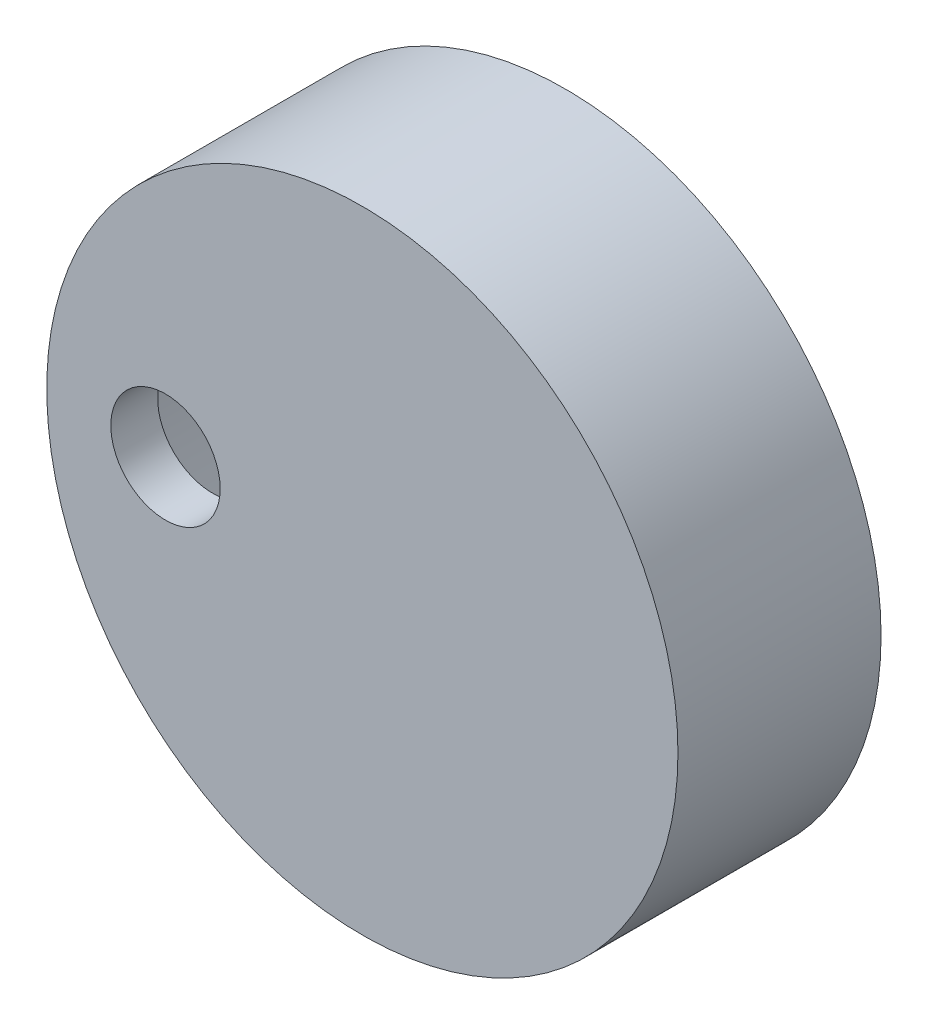
ISO-10303-21;
HEADER;
FILE_DESCRIPTION(('STEP AP214'),'2;1');
FILE_NAME('part.step','',(''),(''),'','','');
FILE_SCHEMA(('AUTOMOTIVE_DESIGN { 1 0 10303 214 1 1 1 1 }'));
ENDSEC;
DATA;
#1=APPLICATION_CONTEXT('core data for automotive mechanical design processes');
#2=APPLICATION_PROTOCOL_DEFINITION('international standard','automotive_design',2000,#1);
#3=PRODUCT_CONTEXT('',#1,'mechanical');
#4=PRODUCT('Part','Part','',(#3));
#5=PRODUCT_RELATED_PRODUCT_CATEGORY('part','',(#4));
#6=PRODUCT_DEFINITION_FORMATION('','',#4);
#7=PRODUCT_DEFINITION_CONTEXT('part definition',#1,'design');
#8=PRODUCT_DEFINITION('design','',#6,#7);
#9=PRODUCT_DEFINITION_SHAPE('','',#8);
#10=(LENGTH_UNIT() NAMED_UNIT(*) SI_UNIT(.MILLI.,.METRE.));
#11=(NAMED_UNIT(*) PLANE_ANGLE_UNIT() SI_UNIT($,.RADIAN.));
#12=(NAMED_UNIT(*) SI_UNIT($,.STERADIAN.) SOLID_ANGLE_UNIT());
#13=UNCERTAINTY_MEASURE_WITH_UNIT(LENGTH_MEASURE(1.E-05),#10,'distance_accuracy_value','');
#14=(GEOMETRIC_REPRESENTATION_CONTEXT(3) GLOBAL_UNCERTAINTY_ASSIGNED_CONTEXT((#13)) GLOBAL_UNIT_ASSIGNED_CONTEXT((#10,
#11,#12)) REPRESENTATION_CONTEXT('',''));
#15=CARTESIAN_POINT('',(0.,0.,0.));
#16=DIRECTION('',(0.,0.,1.));
#17=DIRECTION('',(1.,0.,0.));
#18=AXIS2_PLACEMENT_3D('',#15,#16,#17);
#19=CARTESIAN_POINT('',(-10.1606171532936,18.1202292501439,-5.));
#20=DIRECTION('',(0.,0.,1.));
#21=DIRECTION('',(1.,0.,0.));
#22=AXIS2_PLACEMENT_3D('',#19,#20,#21);
#23=CYLINDRICAL_SURFACE('',#22,8.6);
#24=CARTESIAN_POINT('',(-10.1606171532936,18.1202292501439,-5.));
#25=DIRECTION('',(0.,0.,1.));
#26=DIRECTION('',(1.,0.,0.));
#27=AXIS2_PLACEMENT_3D('',#24,#25,#26);
#28=CIRCLE('',#27,8.6);
#29=CARTESIAN_POINT('',(-1.56061715329361,18.1202292501439,-5.));
#30=VERTEX_POINT('',#29);
#31=EDGE_CURVE('E42',#30,#30,#28,.T.);
#32=ORIENTED_EDGE('',*,*,#31,.F.);
#33=EDGE_LOOP('',(#32));
#34=FACE_BOUND('',#33,.T.);
#35=CARTESIAN_POINT('',(-10.1606171532936,18.1202292501439,0.));
#36=DIRECTION('',(0.,0.,1.));
#37=DIRECTION('',(1.,0.,0.));
#38=AXIS2_PLACEMENT_3D('',#35,#36,#37);
#39=CIRCLE('',#38,8.6);
#40=CARTESIAN_POINT('',(-1.56061715329361,18.1202292501439,0.));
#41=VERTEX_POINT('',#40);
#42=EDGE_CURVE('E10',#41,#41,#39,.F.);
#43=ORIENTED_EDGE('',*,*,#42,.F.);
#44=EDGE_LOOP('',(#43));
#45=FACE_BOUND('',#44,.T.);
#46=ADVANCED_FACE('F31',(#34,#45),#23,.F.);
#47=CARTESIAN_POINT('',(-10.1606171532936,18.1202292501439,-5.));
#48=DIRECTION('',(0.,0.,1.));
#49=DIRECTION('',(1.,0.,0.));
#50=AXIS2_PLACEMENT_3D('',#47,#48,#49);
#51=CYLINDRICAL_SURFACE('',#50,10.1);
#52=CARTESIAN_POINT('',(-10.1606171532936,18.1202292501439,1.5));
#53=DIRECTION('',(0.,0.,1.));
#54=DIRECTION('',(1.,0.,0.));
#55=AXIS2_PLACEMENT_3D('',#52,#53,#54);
#56=CIRCLE('',#55,10.1);
#57=CARTESIAN_POINT('',(-0.0606171532936111,18.1202292501439,1.5));
#58=VERTEX_POINT('',#57);
#59=EDGE_CURVE('E46',#58,#58,#56,.T.);
#60=ORIENTED_EDGE('',*,*,#59,.F.);
#61=EDGE_LOOP('',(#60));
#62=FACE_BOUND('',#61,.T.);
#63=CARTESIAN_POINT('',(-10.1606171532936,18.1202292501439,-5.));
#64=DIRECTION('',(0.,0.,1.));
#65=DIRECTION('',(1.,0.,0.));
#66=AXIS2_PLACEMENT_3D('',#63,#64,#65);
#67=CIRCLE('',#66,10.1);
#68=CARTESIAN_POINT('',(-0.0606171532936111,18.1202292501439,-5.));
#69=VERTEX_POINT('',#68);
#70=EDGE_CURVE('E38',#69,#69,#67,.T.);
#71=ORIENTED_EDGE('',*,*,#70,.T.);
#72=EDGE_LOOP('',(#71));
#73=FACE_BOUND('',#72,.T.);
#74=ADVANCED_FACE('F33',(#62,#73),#51,.T.);
#75=CARTESIAN_POINT('',(-10.1606171532936,18.1202292501439,-5.));
#76=DIRECTION('',(0.,0.,1.));
#77=DIRECTION('',(1.,0.,0.));
#78=AXIS2_PLACEMENT_3D('',#75,#76,#77);
#79=PLANE('',#78);
#80=ORIENTED_EDGE('',*,*,#31,.T.);
#81=EDGE_LOOP('',(#80));
#82=FACE_BOUND('',#81,.T.);
#83=ORIENTED_EDGE('',*,*,#70,.F.);
#84=EDGE_LOOP('',(#83));
#85=FACE_BOUND('',#84,.T.);
#86=ADVANCED_FACE('F69',(#82,#85),#79,.F.);
#87=CARTESIAN_POINT('',(-10.1606171532936,18.1202292501439,1.5));
#88=DIRECTION('',(0.,0.,1.));
#89=DIRECTION('',(1.,0.,0.));
#90=AXIS2_PLACEMENT_3D('',#87,#88,#89);
#91=PLANE('',#90);
#92=CARTESIAN_POINT('',(-16.4606171532936,18.1202292501439,1.5));
#93=DIRECTION('',(0.,0.,1.));
#94=DIRECTION('',(1.,0.,0.));
#95=AXIS2_PLACEMENT_3D('',#92,#93,#94);
#96=CIRCLE('',#95,1.75);
#97=CARTESIAN_POINT('',(-14.7106171532936,18.1202292501439,1.5));
#98=VERTEX_POINT('',#97);
#99=EDGE_CURVE('E52',#98,#98,#96,.T.);
#100=ORIENTED_EDGE('',*,*,#99,.F.);
#101=EDGE_LOOP('',(#100));
#102=FACE_BOUND('',#101,.T.);
#103=ORIENTED_EDGE('',*,*,#59,.T.);
#104=EDGE_LOOP('',(#103));
#105=FACE_BOUND('',#104,.T.);
#106=ADVANCED_FACE('F66',(#102,#105),#91,.T.);
#107=CARTESIAN_POINT('',(-10.1606171532936,18.1202292501439,0.));
#108=DIRECTION('',(0.,0.,1.));
#109=DIRECTION('',(1.,0.,0.));
#110=AXIS2_PLACEMENT_3D('',#107,#108,#109);
#111=PLANE('',#110);
#112=CARTESIAN_POINT('',(-16.4606171532936,18.1202292501439,0.));
#113=DIRECTION('',(0.,0.,1.));
#114=DIRECTION('',(1.,0.,0.));
#115=AXIS2_PLACEMENT_3D('',#112,#113,#114);
#116=CIRCLE('',#115,1.75);
#117=CARTESIAN_POINT('',(-14.7106171532936,18.1202292501439,0.));
#118=VERTEX_POINT('',#117);
#119=EDGE_CURVE('E51',#118,#118,#116,.T.);
#120=ORIENTED_EDGE('',*,*,#119,.T.);
#121=EDGE_LOOP('',(#120));
#122=FACE_BOUND('',#121,.T.);
#123=ORIENTED_EDGE('',*,*,#42,.T.);
#124=EDGE_LOOP('',(#123));
#125=FACE_BOUND('',#124,.T.);
#126=ADVANCED_FACE('F58',(#122,#125),#111,.F.);
#127=CARTESIAN_POINT('',(-16.4606171532936,18.1202292501439,0.));
#128=DIRECTION('',(0.,0.,1.));
#129=DIRECTION('',(1.,0.,0.));
#130=AXIS2_PLACEMENT_3D('',#127,#128,#129);
#131=CYLINDRICAL_SURFACE('',#130,1.75);
#132=ORIENTED_EDGE('',*,*,#119,.F.);
#133=EDGE_LOOP('',(#132));
#134=FACE_BOUND('',#133,.T.);
#135=ORIENTED_EDGE('',*,*,#99,.T.);
#136=EDGE_LOOP('',(#135));
#137=FACE_BOUND('',#136,.T.);
#138=ADVANCED_FACE('F60',(#134,#137),#131,.F.);
#139=CLOSED_SHELL('',(#46,#74,#86,#106,#126,#138));
#140=MANIFOLD_SOLID_BREP('B2',#139);
#141=ADVANCED_BREP_SHAPE_REPRESENTATION('',(#18,#140),#14);
#142=SHAPE_DEFINITION_REPRESENTATION(#9,#141);
ENDSEC;
END-ISO-10303-21;
